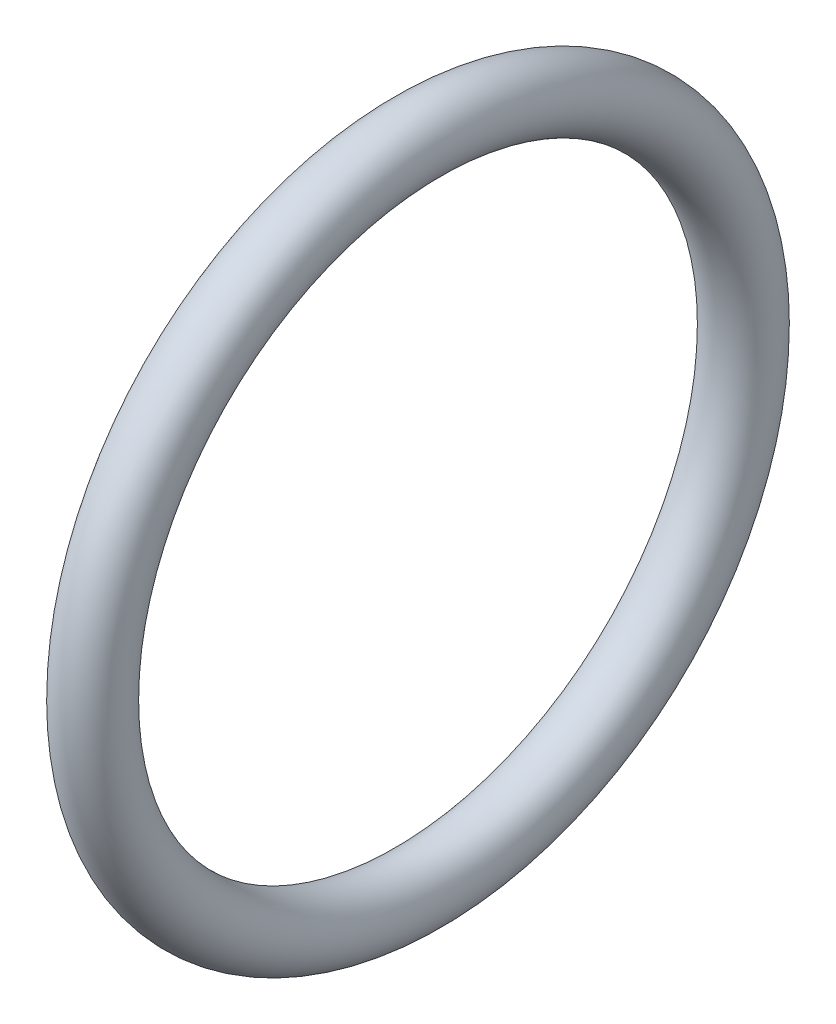
ISO-10303-21;
HEADER;
FILE_DESCRIPTION(('STEP AP214'),'2;1');
FILE_NAME('part.step','',(''),(''),'','','');
FILE_SCHEMA(('AUTOMOTIVE_DESIGN { 1 0 10303 214 1 1 1 1 }'));
ENDSEC;
DATA;
#1=APPLICATION_CONTEXT('core data for automotive mechanical design processes');
#2=APPLICATION_PROTOCOL_DEFINITION('international standard','automotive_design',2000,#1);
#3=PRODUCT_CONTEXT('',#1,'mechanical');
#4=PRODUCT('Part','Part','',(#3));
#5=PRODUCT_RELATED_PRODUCT_CATEGORY('part','',(#4));
#6=PRODUCT_DEFINITION_FORMATION('','',#4);
#7=PRODUCT_DEFINITION_CONTEXT('part definition',#1,'design');
#8=PRODUCT_DEFINITION('design','',#6,#7);
#9=PRODUCT_DEFINITION_SHAPE('','',#8);
#10=(LENGTH_UNIT() NAMED_UNIT(*) SI_UNIT(.MILLI.,.METRE.));
#11=(NAMED_UNIT(*) PLANE_ANGLE_UNIT() SI_UNIT($,.RADIAN.));
#12=(NAMED_UNIT(*) SI_UNIT($,.STERADIAN.) SOLID_ANGLE_UNIT());
#13=UNCERTAINTY_MEASURE_WITH_UNIT(LENGTH_MEASURE(1.E-05),#10,'distance_accuracy_value','');
#14=(GEOMETRIC_REPRESENTATION_CONTEXT(3) GLOBAL_UNCERTAINTY_ASSIGNED_CONTEXT((#13)) GLOBAL_UNIT_ASSIGNED_CONTEXT((#10,
#11,#12)) REPRESENTATION_CONTEXT('',''));
#15=CARTESIAN_POINT('',(0.,0.,0.));
#16=DIRECTION('',(0.,0.,1.));
#17=DIRECTION('',(1.,0.,0.));
#18=AXIS2_PLACEMENT_3D('',#15,#16,#17);
#19=CARTESIAN_POINT('',(0.,0.,0.));
#20=DIRECTION('',(-1.,0.,0.));
#21=DIRECTION('',(0.,0.,1.));
#22=AXIS2_PLACEMENT_3D('',#19,#20,#21);
#23=TOROIDAL_SURFACE('',#22,16.,1.6);
#24=CARTESIAN_POINT('',(0.,0.,17.6));
#25=VERTEX_POINT('',#24);
#26=VERTEX_LOOP('',#25);
#27=FACE_BOUND('',#26,.T.);
#28=ADVANCED_FACE('F30',(#27),#23,.T.);
#29=CLOSED_SHELL('',(#28));
#30=MANIFOLD_SOLID_BREP('B2',#29);
#31=ADVANCED_BREP_SHAPE_REPRESENTATION('',(#18,#30),#14);
#32=SHAPE_DEFINITION_REPRESENTATION(#9,#31);
ENDSEC;
END-ISO-10303-21;
